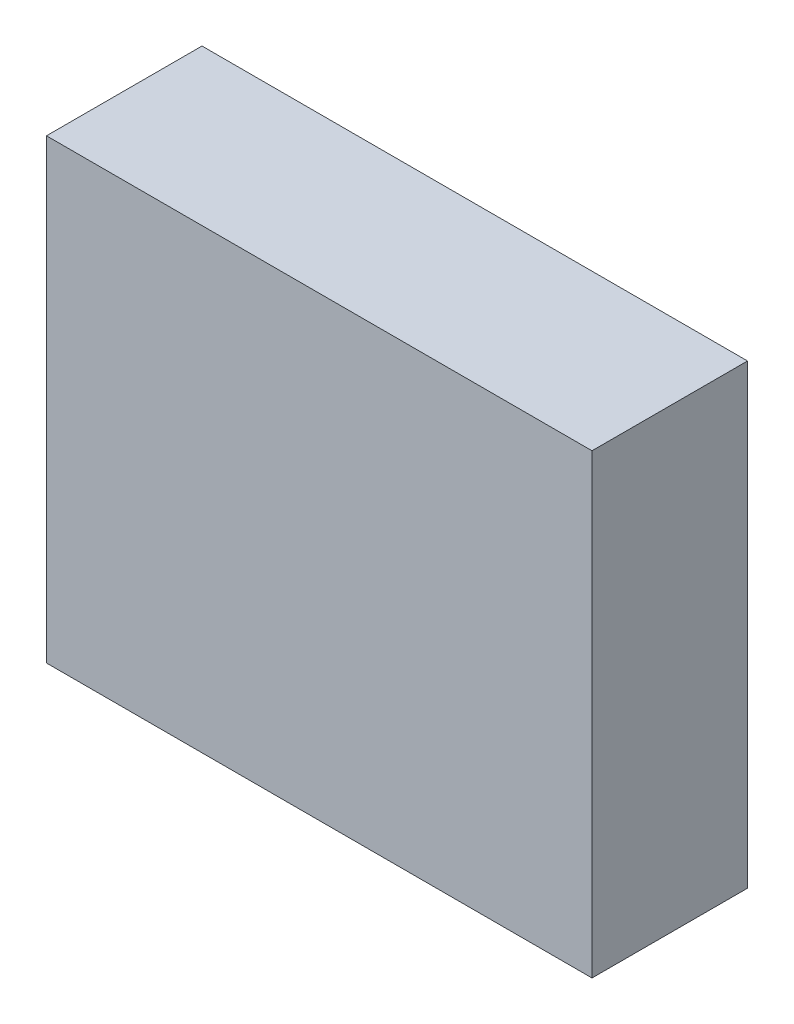
ISO-10303-21;
HEADER;
FILE_DESCRIPTION(('STEP AP214'),'2;1');
FILE_NAME('part.step','',(''),(''),'','','');
FILE_SCHEMA(('AUTOMOTIVE_DESIGN { 1 0 10303 214 1 1 1 1 }'));
ENDSEC;
DATA;
#1=APPLICATION_CONTEXT('core data for automotive mechanical design processes');
#2=APPLICATION_PROTOCOL_DEFINITION('international standard','automotive_design',2000,#1);
#3=PRODUCT_CONTEXT('',#1,'mechanical');
#4=PRODUCT('Part','Part','',(#3));
#5=PRODUCT_RELATED_PRODUCT_CATEGORY('part','',(#4));
#6=PRODUCT_DEFINITION_FORMATION('','',#4);
#7=PRODUCT_DEFINITION_CONTEXT('part definition',#1,'design');
#8=PRODUCT_DEFINITION('design','',#6,#7);
#9=PRODUCT_DEFINITION_SHAPE('','',#8);
#10=(LENGTH_UNIT() NAMED_UNIT(*) SI_UNIT(.MILLI.,.METRE.));
#11=(NAMED_UNIT(*) PLANE_ANGLE_UNIT() SI_UNIT($,.RADIAN.));
#12=(NAMED_UNIT(*) SI_UNIT($,.STERADIAN.) SOLID_ANGLE_UNIT());
#13=UNCERTAINTY_MEASURE_WITH_UNIT(LENGTH_MEASURE(1.E-05),#10,'distance_accuracy_value','');
#14=(GEOMETRIC_REPRESENTATION_CONTEXT(3) GLOBAL_UNCERTAINTY_ASSIGNED_CONTEXT((#13)) GLOBAL_UNIT_ASSIGNED_CONTEXT((#10,
#11,#12)) REPRESENTATION_CONTEXT('',''));
#15=CARTESIAN_POINT('',(0.,0.,0.));
#16=DIRECTION('',(0.,0.,1.));
#17=DIRECTION('',(1.,0.,0.));
#18=AXIS2_PLACEMENT_3D('',#15,#16,#17);
#19=CARTESIAN_POINT('',(0.,0.,0.700024));
#20=DIRECTION('',(0.,0.,1.));
#21=DIRECTION('',(1.,0.,0.));
#22=AXIS2_PLACEMENT_3D('',#19,#20,#21);
#23=PLANE('',#22);
#24=DIRECTION('',(1.,0.,0.));
#25=VECTOR('',#24,1.);
#26=CARTESIAN_POINT('',(-1.227836,1.027684,0.7000239996253));
#27=LINE('',#26,#25);
#28=CARTESIAN_POINT('',(-1.227836,1.027684,0.7000239996253));
#29=VERTEX_POINT('',#28);
#30=CARTESIAN_POINT('',(1.227836,1.027684,0.7000239996253));
#31=VERTEX_POINT('',#30);
#32=EDGE_CURVE('E11',#29,#31,#27,.T.);
#33=ORIENTED_EDGE('',*,*,#32,.F.);
#34=DIRECTION('',(0.,1.,0.));
#35=VECTOR('',#34,1.);
#36=CARTESIAN_POINT('',(-1.227836,-1.027684000213,0.7000239996253));
#37=LINE('',#36,#35);
#38=CARTESIAN_POINT('',(-1.227836,-1.027684000213,0.7000239996253));
#39=VERTEX_POINT('',#38);
#40=EDGE_CURVE('E72',#39,#29,#37,.T.);
#41=ORIENTED_EDGE('',*,*,#40,.F.);
#42=DIRECTION('',(-1.,-8.687371562025E-11,0.));
#43=VECTOR('',#42,1.);
#44=CARTESIAN_POINT('',(1.227836,-1.027684,0.7000239996253));
#45=LINE('',#44,#43);
#46=CARTESIAN_POINT('',(1.227836,-1.027684,0.7000239996253));
#47=VERTEX_POINT('',#46);
#48=EDGE_CURVE('E105',#47,#39,#45,.T.);
#49=ORIENTED_EDGE('',*,*,#48,.F.);
#50=DIRECTION('',(0.,-1.,0.));
#51=VECTOR('',#50,1.);
#52=CARTESIAN_POINT('',(1.227836,1.027684,0.7000239996253));
#53=LINE('',#52,#51);
#54=EDGE_CURVE('E98',#31,#47,#53,.T.);
#55=ORIENTED_EDGE('',*,*,#54,.F.);
#56=EDGE_LOOP('',(#33,#41,#49,#55));
#57=FACE_BOUND('',#56,.T.);
#58=ADVANCED_FACE('F18',(#57),#23,.T.);
#59=CARTESIAN_POINT('',(1.227836,1.027684,0.));
#60=DIRECTION('',(0.,1.,0.));
#61=DIRECTION('',(1.,0.,0.));
#62=AXIS2_PLACEMENT_3D('',#59,#60,#61);
#63=PLANE('',#62);
#64=ORIENTED_EDGE('',*,*,#32,.T.);
#65=DIRECTION('',(-9.523483797466E-11,-2.904662558227E-10,-1.));
#66=VECTOR('',#65,1.);
#67=CARTESIAN_POINT('',(1.227836,1.027684,0.7000239996253));
#68=LINE('',#67,#66);
#69=CARTESIAN_POINT('',(1.227835999933,1.027683999797,0.));
#70=VERTEX_POINT('',#69);
#71=EDGE_CURVE('E28',#31,#70,#68,.T.);
#72=ORIENTED_EDGE('',*,*,#71,.T.);
#73=DIRECTION('',(1.,0.,0.));
#74=VECTOR('',#73,1.);
#75=CARTESIAN_POINT('',(-1.227835999933,1.027683999797,0.));
#76=LINE('',#75,#74);
#77=CARTESIAN_POINT('',(-1.227835999933,1.027683999797,0.));
#78=VERTEX_POINT('',#77);
#79=EDGE_CURVE('E80',#78,#70,#76,.T.);
#80=ORIENTED_EDGE('',*,*,#79,.F.);
#81=DIRECTION('',(9.523483797466E-11,-2.904662558227E-10,-1.));
#82=VECTOR('',#81,1.);
#83=CARTESIAN_POINT('',(-1.227836,1.027684,0.7000239996253));
#84=LINE('',#83,#82);
#85=EDGE_CURVE('E21',#29,#78,#84,.T.);
#86=ORIENTED_EDGE('',*,*,#85,.F.);
#87=EDGE_LOOP('',(#64,#72,#80,#86));
#88=FACE_BOUND('',#87,.T.);
#89=ADVANCED_FACE('F84',(#88),#63,.T.);
#90=CARTESIAN_POINT('',(1.227836,-1.027684,0.));
#91=DIRECTION('',(1.,0.,0.));
#92=DIRECTION('',(0.,1.,0.));
#93=AXIS2_PLACEMENT_3D('',#90,#91,#92);
#94=PLANE('',#93);
#95=ORIENTED_EDGE('',*,*,#54,.T.);
#96=DIRECTION('',(-9.523483797466E-11,2.904662558227E-10,-1.));
#97=VECTOR('',#96,1.);
#98=CARTESIAN_POINT('',(1.227836,-1.027684,0.7000239996253));
#99=LINE('',#98,#97);
#100=CARTESIAN_POINT('',(1.227835999933,-1.027683999797,0.));
#101=VERTEX_POINT('',#100);
#102=EDGE_CURVE('E100',#47,#101,#99,.T.);
#103=ORIENTED_EDGE('',*,*,#102,.T.);
#104=DIRECTION('',(0.,-1.,0.));
#105=VECTOR('',#104,1.);
#106=CARTESIAN_POINT('',(1.227835999933,1.027683999797,0.));
#107=LINE('',#106,#105);
#108=EDGE_CURVE('E87',#70,#101,#107,.T.);
#109=ORIENTED_EDGE('',*,*,#108,.F.);
#110=ORIENTED_EDGE('',*,*,#71,.F.);
#111=EDGE_LOOP('',(#95,#103,#109,#110));
#112=FACE_BOUND('',#111,.T.);
#113=ADVANCED_FACE('F159',(#112),#94,.T.);
#114=CARTESIAN_POINT('',(-1.227836,-1.027684,0.));
#115=DIRECTION('',(0.,-1.,0.));
#116=DIRECTION('',(0.,0.,-1.));
#117=AXIS2_PLACEMENT_3D('',#114,#115,#116);
#118=PLANE('',#117);
#119=ORIENTED_EDGE('',*,*,#48,.T.);
#120=DIRECTION('',(9.523483797466E-11,2.904662558227E-10,-1.));
#121=VECTOR('',#120,1.);
#122=CARTESIAN_POINT('',(-1.227836,-1.027684000213,0.7000239996253));
#123=LINE('',#122,#121);
#124=CARTESIAN_POINT('',(-1.227835999933,-1.02768400001,0.));
#125=VERTEX_POINT('',#124);
#126=EDGE_CURVE('E75',#39,#125,#123,.T.);
#127=ORIENTED_EDGE('',*,*,#126,.T.);
#128=DIRECTION('',(-1.,-8.687371562497E-11,0.));
#129=VECTOR('',#128,1.);
#130=CARTESIAN_POINT('',(1.227835999933,-1.027683999797,0.));
#131=LINE('',#130,#129);
#132=EDGE_CURVE('E82',#101,#125,#131,.T.);
#133=ORIENTED_EDGE('',*,*,#132,.F.);
#134=ORIENTED_EDGE('',*,*,#102,.F.);
#135=EDGE_LOOP('',(#119,#127,#133,#134));
#136=FACE_BOUND('',#135,.T.);
#137=ADVANCED_FACE('F146',(#136),#118,.T.);
#138=CARTESIAN_POINT('',(-1.227836,1.027684,0.));
#139=DIRECTION('',(-1.,0.,0.));
#140=DIRECTION('',(0.,0.,1.));
#141=AXIS2_PLACEMENT_3D('',#138,#139,#140);
#142=PLANE('',#141);
#143=ORIENTED_EDGE('',*,*,#40,.T.);
#144=ORIENTED_EDGE('',*,*,#85,.T.);
#145=DIRECTION('',(0.,1.,0.));
#146=VECTOR('',#145,1.);
#147=CARTESIAN_POINT('',(-1.227835999933,-1.02768400001,0.));
#148=LINE('',#147,#146);
#149=EDGE_CURVE('E69',#125,#78,#148,.T.);
#150=ORIENTED_EDGE('',*,*,#149,.F.);
#151=ORIENTED_EDGE('',*,*,#126,.F.);
#152=EDGE_LOOP('',(#143,#144,#150,#151));
#153=FACE_BOUND('',#152,.T.);
#154=ADVANCED_FACE('F67',(#153),#142,.T.);
#155=CARTESIAN_POINT('',(0.,0.,0.));
#156=DIRECTION('',(0.,0.,1.));
#157=DIRECTION('',(1.,0.,0.));
#158=AXIS2_PLACEMENT_3D('',#155,#156,#157);
#159=PLANE('',#158);
#160=ORIENTED_EDGE('',*,*,#79,.T.);
#161=ORIENTED_EDGE('',*,*,#108,.T.);
#162=ORIENTED_EDGE('',*,*,#132,.T.);
#163=ORIENTED_EDGE('',*,*,#149,.T.);
#164=EDGE_LOOP('',(#160,#161,#162,#163));
#165=FACE_BOUND('',#164,.T.);
#166=ADVANCED_FACE('F78',(#165),#159,.F.);
#167=CLOSED_SHELL('',(#58,#89,#113,#137,#154,#166));
#168=MANIFOLD_SOLID_BREP('B1',#167);
#169=ADVANCED_BREP_SHAPE_REPRESENTATION('',(#18,#168),#14);
#170=SHAPE_DEFINITION_REPRESENTATION(#9,#169);
ENDSEC;
END-ISO-10303-21;
